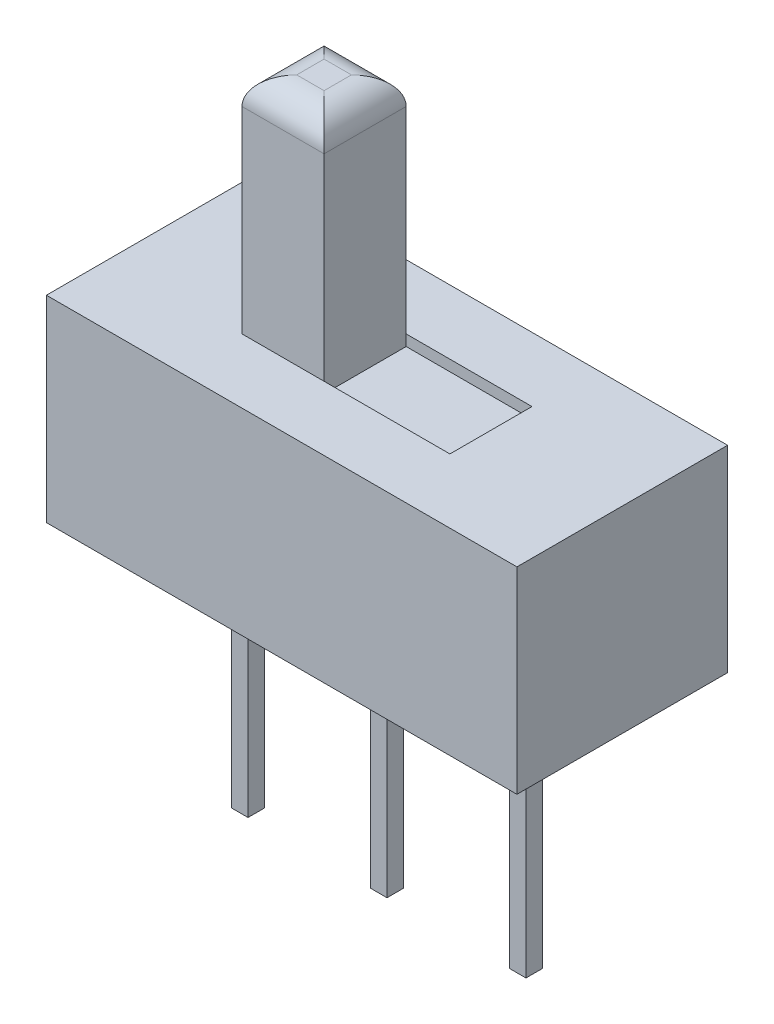
ISO-10303-21;
HEADER;
FILE_DESCRIPTION(('STEP AP214'),'2;1');
FILE_NAME('part.step','',(''),(''),'','','');
FILE_SCHEMA(('AUTOMOTIVE_DESIGN { 1 0 10303 214 1 1 1 1 }'));
ENDSEC;
DATA;
#1=APPLICATION_CONTEXT('core data for automotive mechanical design processes');
#2=APPLICATION_PROTOCOL_DEFINITION('international standard','automotive_design',2000,#1);
#3=PRODUCT_CONTEXT('',#1,'mechanical');
#4=PRODUCT('Part','Part','',(#3));
#5=PRODUCT_RELATED_PRODUCT_CATEGORY('part','',(#4));
#6=PRODUCT_DEFINITION_FORMATION('','',#4);
#7=PRODUCT_DEFINITION_CONTEXT('part definition',#1,'design');
#8=PRODUCT_DEFINITION('design','',#6,#7);
#9=PRODUCT_DEFINITION_SHAPE('','',#8);
#10=(LENGTH_UNIT() NAMED_UNIT(*) SI_UNIT(.MILLI.,.METRE.));
#11=(NAMED_UNIT(*) PLANE_ANGLE_UNIT() SI_UNIT($,.RADIAN.));
#12=(NAMED_UNIT(*) SI_UNIT($,.STERADIAN.) SOLID_ANGLE_UNIT());
#13=UNCERTAINTY_MEASURE_WITH_UNIT(LENGTH_MEASURE(1.E-05),#10,'distance_accuracy_value','');
#14=(GEOMETRIC_REPRESENTATION_CONTEXT(3) GLOBAL_UNCERTAINTY_ASSIGNED_CONTEXT((#13)) GLOBAL_UNIT_ASSIGNED_CONTEXT((#10,
#11,#12)) REPRESENTATION_CONTEXT('',''));
#15=CARTESIAN_POINT('',(0.,0.,0.));
#16=DIRECTION('',(0.,0.,1.));
#17=DIRECTION('',(1.,0.,0.));
#18=AXIS2_PLACEMENT_3D('',#15,#16,#17);
#19=CARTESIAN_POINT('',(0.,0.,0.));
#20=DIRECTION('',(0.,-1.,0.));
#21=DIRECTION('',(0.,0.,-1.));
#22=AXIS2_PLACEMENT_3D('',#19,#20,#21);
#23=PLANE('',#22);
#24=DIRECTION('',(0.,0.,-1.));
#25=VECTOR('',#24,1.);
#26=CARTESIAN_POINT('',(4.3,0.,1.925));
#27=LINE('',#26,#25);
#28=CARTESIAN_POINT('',(4.3,0.,1.925));
#29=VERTEX_POINT('',#28);
#30=CARTESIAN_POINT('',(4.3,0.,-1.925));
#31=VERTEX_POINT('',#30);
#32=EDGE_CURVE('E347',#29,#31,#27,.T.);
#33=ORIENTED_EDGE('',*,*,#32,.F.);
#34=DIRECTION('',(1.,0.,0.));
#35=VECTOR('',#34,1.);
#36=CARTESIAN_POINT('',(-4.3,0.,1.925));
#37=LINE('',#36,#35);
#38=CARTESIAN_POINT('',(-4.3,0.,1.925));
#39=VERTEX_POINT('',#38);
#40=EDGE_CURVE('E352',#39,#29,#37,.T.);
#41=ORIENTED_EDGE('',*,*,#40,.F.);
#42=DIRECTION('',(0.,0.,1.));
#43=VECTOR('',#42,1.);
#44=CARTESIAN_POINT('',(-4.3,0.,1.925));
#45=LINE('',#44,#43);
#46=CARTESIAN_POINT('',(-4.3,0.,-1.925));
#47=VERTEX_POINT('',#46);
#48=EDGE_CURVE('E363',#47,#39,#45,.T.);
#49=ORIENTED_EDGE('',*,*,#48,.F.);
#50=DIRECTION('',(-1.,0.,0.));
#51=VECTOR('',#50,1.);
#52=CARTESIAN_POINT('',(-4.3,0.,-1.925));
#53=LINE('',#52,#51);
#54=EDGE_CURVE('E361',#31,#47,#53,.T.);
#55=ORIENTED_EDGE('',*,*,#54,.F.);
#56=EDGE_LOOP('',(#33,#41,#49,#55));
#57=FACE_BOUND('',#56,.T.);
#58=DIRECTION('',(-1.,0.,0.));
#59=VECTOR('',#58,1.);
#60=CARTESIAN_POINT('',(-0.15,0.,0.15));
#61=LINE('',#60,#59);
#62=CARTESIAN_POINT('',(0.15,0.,0.15));
#63=VERTEX_POINT('',#62);
#64=CARTESIAN_POINT('',(-0.15,0.,0.15));
#65=VERTEX_POINT('',#64);
#66=EDGE_CURVE('E283',#63,#65,#61,.T.);
#67=ORIENTED_EDGE('',*,*,#66,.F.);
#68=DIRECTION('',(0.,0.,1.));
#69=VECTOR('',#68,1.);
#70=CARTESIAN_POINT('',(0.15,0.,-0.15));
#71=LINE('',#70,#69);
#72=CARTESIAN_POINT('',(0.15,0.,-0.15));
#73=VERTEX_POINT('',#72);
#74=EDGE_CURVE('E262',#73,#63,#71,.T.);
#75=ORIENTED_EDGE('',*,*,#74,.F.);
#76=DIRECTION('',(1.,0.,0.));
#77=VECTOR('',#76,1.);
#78=CARTESIAN_POINT('',(-0.15,0.,-0.15));
#79=LINE('',#78,#77);
#80=CARTESIAN_POINT('',(-0.15,0.,-0.15));
#81=VERTEX_POINT('',#80);
#82=EDGE_CURVE('E274',#81,#73,#79,.T.);
#83=ORIENTED_EDGE('',*,*,#82,.F.);
#84=DIRECTION('',(0.,0.,-1.));
#85=VECTOR('',#84,1.);
#86=CARTESIAN_POINT('',(-0.15,0.,-0.15));
#87=LINE('',#86,#85);
#88=EDGE_CURVE('E285',#65,#81,#87,.T.);
#89=ORIENTED_EDGE('',*,*,#88,.F.);
#90=EDGE_LOOP('',(#67,#75,#83,#89));
#91=FACE_BOUND('',#90,.T.);
#92=DIRECTION('',(-1.,0.,0.));
#93=VECTOR('',#92,1.);
#94=CARTESIAN_POINT('',(-2.69,0.,0.15));
#95=LINE('',#94,#93);
#96=CARTESIAN_POINT('',(-2.39,0.,0.15));
#97=VERTEX_POINT('',#96);
#98=CARTESIAN_POINT('',(-2.69,0.,0.15));
#99=VERTEX_POINT('',#98);
#100=EDGE_CURVE('E257',#97,#99,#95,.T.);
#101=ORIENTED_EDGE('',*,*,#100,.F.);
#102=DIRECTION('',(0.,0.,1.));
#103=VECTOR('',#102,1.);
#104=CARTESIAN_POINT('',(-2.39,0.,-0.15));
#105=LINE('',#104,#103);
#106=CARTESIAN_POINT('',(-2.39,0.,-0.15));
#107=VERTEX_POINT('',#106);
#108=EDGE_CURVE('E259',#107,#97,#105,.T.);
#109=ORIENTED_EDGE('',*,*,#108,.F.);
#110=DIRECTION('',(1.,0.,0.));
#111=VECTOR('',#110,1.);
#112=CARTESIAN_POINT('',(-2.69,0.,-0.15));
#113=LINE('',#112,#111);
#114=CARTESIAN_POINT('',(-2.69,0.,-0.15));
#115=VERTEX_POINT('',#114);
#116=EDGE_CURVE('E252',#115,#107,#113,.T.);
#117=ORIENTED_EDGE('',*,*,#116,.F.);
#118=DIRECTION('',(0.,0.,-1.));
#119=VECTOR('',#118,1.);
#120=CARTESIAN_POINT('',(-2.69,0.,-0.15));
#121=LINE('',#120,#119);
#122=EDGE_CURVE('E254',#99,#115,#121,.T.);
#123=ORIENTED_EDGE('',*,*,#122,.F.);
#124=EDGE_LOOP('',(#101,#109,#117,#123));
#125=FACE_BOUND('',#124,.T.);
#126=DIRECTION('',(-1.,0.,0.));
#127=VECTOR('',#126,1.);
#128=CARTESIAN_POINT('',(2.39,0.,0.15));
#129=LINE('',#128,#127);
#130=CARTESIAN_POINT('',(2.69,0.,0.15));
#131=VERTEX_POINT('',#130);
#132=CARTESIAN_POINT('',(2.39,0.,0.15));
#133=VERTEX_POINT('',#132);
#134=EDGE_CURVE('E231',#131,#133,#129,.T.);
#135=ORIENTED_EDGE('',*,*,#134,.F.);
#136=DIRECTION('',(0.,0.,1.));
#137=VECTOR('',#136,1.);
#138=CARTESIAN_POINT('',(2.69,0.,-0.15));
#139=LINE('',#138,#137);
#140=CARTESIAN_POINT('',(2.69,0.,-0.15));
#141=VERTEX_POINT('',#140);
#142=EDGE_CURVE('E226',#141,#131,#139,.T.);
#143=ORIENTED_EDGE('',*,*,#142,.F.);
#144=DIRECTION('',(1.,0.,0.));
#145=VECTOR('',#144,1.);
#146=CARTESIAN_POINT('',(2.39,0.,-0.15));
#147=LINE('',#146,#145);
#148=CARTESIAN_POINT('',(2.39,0.,-0.15));
#149=VERTEX_POINT('',#148);
#150=EDGE_CURVE('E211',#149,#141,#147,.T.);
#151=ORIENTED_EDGE('',*,*,#150,.F.);
#152=DIRECTION('',(0.,0.,-1.));
#153=VECTOR('',#152,1.);
#154=CARTESIAN_POINT('',(2.39,0.,-0.15));
#155=LINE('',#154,#153);
#156=EDGE_CURVE('E219',#133,#149,#155,.T.);
#157=ORIENTED_EDGE('',*,*,#156,.F.);
#158=EDGE_LOOP('',(#135,#143,#151,#157));
#159=FACE_BOUND('',#158,.T.);
#160=ADVANCED_FACE('F42',(#57,#91,#125,#159),#23,.T.);
#161=CARTESIAN_POINT('',(0.,3.6,0.));
#162=DIRECTION('',(0.,-1.,0.));
#163=DIRECTION('',(0.,0.,-1.));
#164=AXIS2_PLACEMENT_3D('',#161,#162,#163);
#165=PLANE('',#164);
#166=DIRECTION('',(0.,0.,-1.));
#167=VECTOR('',#166,1.);
#168=CARTESIAN_POINT('',(4.3,3.6,1.925));
#169=LINE('',#168,#167);
#170=CARTESIAN_POINT('',(4.3,3.6,1.925));
#171=VERTEX_POINT('',#170);
#172=CARTESIAN_POINT('',(4.3,3.6,-1.925));
#173=VERTEX_POINT('',#172);
#174=EDGE_CURVE('E348',#171,#173,#169,.T.);
#175=ORIENTED_EDGE('',*,*,#174,.T.);
#176=DIRECTION('',(-1.,0.,0.));
#177=VECTOR('',#176,1.);
#178=CARTESIAN_POINT('',(-4.3,3.6,-1.925));
#179=LINE('',#178,#177);
#180=CARTESIAN_POINT('',(-4.3,3.6,-1.925));
#181=VERTEX_POINT('',#180);
#182=EDGE_CURVE('E351',#173,#181,#179,.T.);
#183=ORIENTED_EDGE('',*,*,#182,.T.);
#184=DIRECTION('',(0.,0.,1.));
#185=VECTOR('',#184,1.);
#186=CARTESIAN_POINT('',(-4.3,3.6,1.925));
#187=LINE('',#186,#185);
#188=CARTESIAN_POINT('',(-4.3,3.6,1.925));
#189=VERTEX_POINT('',#188);
#190=EDGE_CURVE('E354',#181,#189,#187,.T.);
#191=ORIENTED_EDGE('',*,*,#190,.T.);
#192=DIRECTION('',(1.,0.,0.));
#193=VECTOR('',#192,1.);
#194=CARTESIAN_POINT('',(-4.3,3.6,1.925));
#195=LINE('',#194,#193);
#196=EDGE_CURVE('E356',#189,#171,#195,.T.);
#197=ORIENTED_EDGE('',*,*,#196,.T.);
#198=EDGE_LOOP('',(#175,#183,#191,#197));
#199=FACE_BOUND('',#198,.T.);
#200=DIRECTION('',(0.,0.,-1.));
#201=VECTOR('',#200,1.);
#202=CARTESIAN_POINT('',(1.9,3.6,0.75));
#203=LINE('',#202,#201);
#204=CARTESIAN_POINT('',(1.9,3.6,0.75));
#205=VERTEX_POINT('',#204);
#206=CARTESIAN_POINT('',(1.9,3.6,-0.75));
#207=VERTEX_POINT('',#206);
#208=EDGE_CURVE('E313',#205,#207,#203,.T.);
#209=ORIENTED_EDGE('',*,*,#208,.F.);
#210=DIRECTION('',(1.,0.,0.));
#211=VECTOR('',#210,1.);
#212=CARTESIAN_POINT('',(-0.4,3.6,0.75));
#213=LINE('',#212,#211);
#214=CARTESIAN_POINT('',(-0.4,3.6,0.75));
#215=VERTEX_POINT('',#214);
#216=EDGE_CURVE('E303',#215,#205,#213,.T.);
#217=ORIENTED_EDGE('',*,*,#216,.F.);
#218=DIRECTION('',(1.,0.,0.));
#219=VECTOR('',#218,1.);
#220=CARTESIAN_POINT('',(-1.9,3.6,0.75));
#221=LINE('',#220,#219);
#222=CARTESIAN_POINT('',(-1.9,3.6,0.75));
#223=VERTEX_POINT('',#222);
#224=EDGE_CURVE('E336',#223,#215,#221,.T.);
#225=ORIENTED_EDGE('',*,*,#224,.F.);
#226=DIRECTION('',(0.,0.,1.));
#227=VECTOR('',#226,1.);
#228=CARTESIAN_POINT('',(-1.9,3.6,0.75));
#229=LINE('',#228,#227);
#230=CARTESIAN_POINT('',(-1.9,3.6,-0.75));
#231=VERTEX_POINT('',#230);
#232=EDGE_CURVE('E333',#231,#223,#229,.T.);
#233=ORIENTED_EDGE('',*,*,#232,.F.);
#234=DIRECTION('',(-1.,0.,0.));
#235=VECTOR('',#234,1.);
#236=CARTESIAN_POINT('',(-1.9,3.6,-0.75));
#237=LINE('',#236,#235);
#238=CARTESIAN_POINT('',(-0.4,3.6,-0.75));
#239=VERTEX_POINT('',#238);
#240=EDGE_CURVE('E323',#239,#231,#237,.T.);
#241=ORIENTED_EDGE('',*,*,#240,.F.);
#242=DIRECTION('',(-1.,0.,0.));
#243=VECTOR('',#242,1.);
#244=CARTESIAN_POINT('',(-0.4,3.6,-0.75));
#245=LINE('',#244,#243);
#246=EDGE_CURVE('E316',#207,#239,#245,.T.);
#247=ORIENTED_EDGE('',*,*,#246,.F.);
#248=EDGE_LOOP('',(#209,#217,#225,#233,#241,#247));
#249=FACE_BOUND('',#248,.T.);
#250=ADVANCED_FACE('F425',(#199,#249),#165,.F.);
#251=CARTESIAN_POINT('',(4.3,3.6,1.925));
#252=DIRECTION('',(-1.,0.,0.));
#253=DIRECTION('',(0.,0.,1.));
#254=AXIS2_PLACEMENT_3D('',#251,#252,#253);
#255=PLANE('',#254);
#256=ORIENTED_EDGE('',*,*,#32,.T.);
#257=DIRECTION('',(0.,-1.,0.));
#258=VECTOR('',#257,1.);
#259=CARTESIAN_POINT('',(4.3,3.6,-1.925));
#260=LINE('',#259,#258);
#261=EDGE_CURVE('E374',#173,#31,#260,.T.);
#262=ORIENTED_EDGE('',*,*,#261,.F.);
#263=ORIENTED_EDGE('',*,*,#174,.F.);
#264=DIRECTION('',(0.,-1.,0.));
#265=VECTOR('',#264,1.);
#266=CARTESIAN_POINT('',(4.3,3.6,1.925));
#267=LINE('',#266,#265);
#268=EDGE_CURVE('E358',#171,#29,#267,.T.);
#269=ORIENTED_EDGE('',*,*,#268,.T.);
#270=EDGE_LOOP('',(#256,#262,#263,#269));
#271=FACE_BOUND('',#270,.T.);
#272=ADVANCED_FACE('F458',(#271),#255,.F.);
#273=CARTESIAN_POINT('',(-4.3,3.6,-1.925));
#274=DIRECTION('',(0.,0.,1.));
#275=DIRECTION('',(1.,0.,0.));
#276=AXIS2_PLACEMENT_3D('',#273,#274,#275);
#277=PLANE('',#276);
#278=ORIENTED_EDGE('',*,*,#54,.T.);
#279=DIRECTION('',(0.,-1.,0.));
#280=VECTOR('',#279,1.);
#281=CARTESIAN_POINT('',(-4.3,3.6,-1.925));
#282=LINE('',#281,#280);
#283=EDGE_CURVE('E371',#181,#47,#282,.T.);
#284=ORIENTED_EDGE('',*,*,#283,.F.);
#285=ORIENTED_EDGE('',*,*,#182,.F.);
#286=ORIENTED_EDGE('',*,*,#261,.T.);
#287=EDGE_LOOP('',(#278,#284,#285,#286));
#288=FACE_BOUND('',#287,.T.);
#289=ADVANCED_FACE('F472',(#288),#277,.F.);
#290=CARTESIAN_POINT('',(-4.3,3.6,1.925));
#291=DIRECTION('',(1.,0.,0.));
#292=DIRECTION('',(0.,0.,-1.));
#293=AXIS2_PLACEMENT_3D('',#290,#291,#292);
#294=PLANE('',#293);
#295=ORIENTED_EDGE('',*,*,#48,.T.);
#296=DIRECTION('',(0.,-1.,0.));
#297=VECTOR('',#296,1.);
#298=CARTESIAN_POINT('',(-4.3,3.6,1.925));
#299=LINE('',#298,#297);
#300=EDGE_CURVE('E368',#189,#39,#299,.T.);
#301=ORIENTED_EDGE('',*,*,#300,.F.);
#302=ORIENTED_EDGE('',*,*,#190,.F.);
#303=ORIENTED_EDGE('',*,*,#283,.T.);
#304=EDGE_LOOP('',(#295,#301,#302,#303));
#305=FACE_BOUND('',#304,.T.);
#306=ADVANCED_FACE('F468',(#305),#294,.F.);
#307=CARTESIAN_POINT('',(-4.3,3.6,1.925));
#308=DIRECTION('',(0.,0.,-1.));
#309=DIRECTION('',(-1.,0.,0.));
#310=AXIS2_PLACEMENT_3D('',#307,#308,#309);
#311=PLANE('',#310);
#312=ORIENTED_EDGE('',*,*,#40,.T.);
#313=ORIENTED_EDGE('',*,*,#268,.F.);
#314=ORIENTED_EDGE('',*,*,#196,.F.);
#315=ORIENTED_EDGE('',*,*,#300,.T.);
#316=EDGE_LOOP('',(#312,#313,#314,#315));
#317=FACE_BOUND('',#316,.T.);
#318=ADVANCED_FACE('F465',(#317),#311,.F.);
#319=CARTESIAN_POINT('',(-0.4,7.7,0.75));
#320=DIRECTION('',(-1.,0.,0.));
#321=DIRECTION('',(0.,0.,1.));
#322=AXIS2_PLACEMENT_3D('',#319,#320,#321);
#323=PLANE('',#322);
#324=DIRECTION('',(0.,-1.,0.));
#325=VECTOR('',#324,1.);
#326=CARTESIAN_POINT('',(-0.4,7.7,-0.75));
#327=LINE('',#326,#325);
#328=CARTESIAN_POINT('',(-0.4,7.2,-0.75));
#329=VERTEX_POINT('',#328);
#330=EDGE_CURVE('E345',#329,#239,#327,.T.);
#331=ORIENTED_EDGE('',*,*,#330,.F.);
#332=DIRECTION('',(0.,0.,-1.));
#333=VECTOR('',#332,1.);
#334=CARTESIAN_POINT('',(-0.4,7.2,0.75));
#335=LINE('',#334,#333);
#336=CARTESIAN_POINT('',(-0.4,7.2,0.75));
#337=VERTEX_POINT('',#336);
#338=EDGE_CURVE('E11',#329,#337,#335,.F.);
#339=ORIENTED_EDGE('',*,*,#338,.T.);
#340=DIRECTION('',(0.,-1.,0.));
#341=VECTOR('',#340,1.);
#342=CARTESIAN_POINT('',(-0.4,7.7,0.75));
#343=LINE('',#342,#341);
#344=EDGE_CURVE('E339',#337,#215,#343,.T.);
#345=ORIENTED_EDGE('',*,*,#344,.T.);
#346=DIRECTION('',(0.,1.,0.));
#347=VECTOR('',#346,1.);
#348=CARTESIAN_POINT('',(-0.4,3.4,0.75));
#349=LINE('',#348,#347);
#350=CARTESIAN_POINT('',(-0.4,3.4,0.75));
#351=VERTEX_POINT('',#350);
#352=EDGE_CURVE('E324',#351,#215,#349,.T.);
#353=ORIENTED_EDGE('',*,*,#352,.F.);
#354=DIRECTION('',(0.,0.,1.));
#355=VECTOR('',#354,1.);
#356=CARTESIAN_POINT('',(-0.4,3.4,0.75));
#357=LINE('',#356,#355);
#358=CARTESIAN_POINT('',(-0.4,3.4,-0.75));
#359=VERTEX_POINT('',#358);
#360=EDGE_CURVE('E306',#359,#351,#357,.T.);
#361=ORIENTED_EDGE('',*,*,#360,.F.);
#362=DIRECTION('',(0.,1.,0.));
#363=VECTOR('',#362,1.);
#364=CARTESIAN_POINT('',(-0.4,3.4,-0.75));
#365=LINE('',#364,#363);
#366=EDGE_CURVE('E327',#359,#239,#365,.T.);
#367=ORIENTED_EDGE('',*,*,#366,.T.);
#368=EDGE_LOOP('',(#331,#339,#345,#353,#361,#367));
#369=FACE_BOUND('',#368,.T.);
#370=ADVANCED_FACE('F415',(#369),#323,.F.);
#371=CARTESIAN_POINT('',(-1.9,7.7,-0.75));
#372=DIRECTION('',(0.,0.,1.));
#373=DIRECTION('',(1.,0.,0.));
#374=AXIS2_PLACEMENT_3D('',#371,#372,#373);
#375=PLANE('',#374);
#376=DIRECTION('',(0.,-1.,0.));
#377=VECTOR('',#376,1.);
#378=CARTESIAN_POINT('',(-1.9,7.7,-0.75));
#379=LINE('',#378,#377);
#380=CARTESIAN_POINT('',(-1.9,7.2,-0.75));
#381=VERTEX_POINT('',#380);
#382=EDGE_CURVE('E343',#381,#231,#379,.T.);
#383=ORIENTED_EDGE('',*,*,#382,.F.);
#384=DIRECTION('',(-1.,0.,0.));
#385=VECTOR('',#384,1.);
#386=CARTESIAN_POINT('',(-1.9,7.2,-0.75));
#387=LINE('',#386,#385);
#388=EDGE_CURVE('E51',#381,#329,#387,.F.);
#389=ORIENTED_EDGE('',*,*,#388,.T.);
#390=ORIENTED_EDGE('',*,*,#330,.T.);
#391=ORIENTED_EDGE('',*,*,#240,.T.);
#392=EDGE_LOOP('',(#383,#389,#390,#391));
#393=FACE_BOUND('',#392,.T.);
#394=ADVANCED_FACE('F413',(#393),#375,.F.);
#395=CARTESIAN_POINT('',(-1.9,7.7,0.75));
#396=DIRECTION('',(1.,0.,0.));
#397=DIRECTION('',(0.,0.,-1.));
#398=AXIS2_PLACEMENT_3D('',#395,#396,#397);
#399=PLANE('',#398);
#400=DIRECTION('',(0.,-1.,0.));
#401=VECTOR('',#400,1.);
#402=CARTESIAN_POINT('',(-1.9,7.7,0.75));
#403=LINE('',#402,#401);
#404=CARTESIAN_POINT('',(-1.9,7.2,0.75));
#405=VERTEX_POINT('',#404);
#406=EDGE_CURVE('E341',#405,#223,#403,.T.);
#407=ORIENTED_EDGE('',*,*,#406,.F.);
#408=DIRECTION('',(0.,0.,1.));
#409=VECTOR('',#408,1.);
#410=CARTESIAN_POINT('',(-1.9,7.2,0.75));
#411=LINE('',#410,#409);
#412=EDGE_CURVE('E389',#405,#381,#411,.F.);
#413=ORIENTED_EDGE('',*,*,#412,.T.);
#414=ORIENTED_EDGE('',*,*,#382,.T.);
#415=ORIENTED_EDGE('',*,*,#232,.T.);
#416=EDGE_LOOP('',(#407,#413,#414,#415));
#417=FACE_BOUND('',#416,.T.);
#418=ADVANCED_FACE('F430',(#417),#399,.F.);
#419=CARTESIAN_POINT('',(-1.9,7.7,0.75));
#420=DIRECTION('',(0.,0.,-1.));
#421=DIRECTION('',(-1.,0.,0.));
#422=AXIS2_PLACEMENT_3D('',#419,#420,#421);
#423=PLANE('',#422);
#424=ORIENTED_EDGE('',*,*,#344,.F.);
#425=DIRECTION('',(1.,0.,0.));
#426=VECTOR('',#425,1.);
#427=CARTESIAN_POINT('',(-1.9,7.2,0.75));
#428=LINE('',#427,#426);
#429=EDGE_CURVE('E386',#337,#405,#428,.F.);
#430=ORIENTED_EDGE('',*,*,#429,.T.);
#431=ORIENTED_EDGE('',*,*,#406,.T.);
#432=ORIENTED_EDGE('',*,*,#224,.T.);
#433=EDGE_LOOP('',(#424,#430,#431,#432));
#434=FACE_BOUND('',#433,.T.);
#435=ADVANCED_FACE('F432',(#434),#423,.F.);
#436=CARTESIAN_POINT('',(0.,7.7,0.));
#437=DIRECTION('',(0.,-1.,0.));
#438=DIRECTION('',(0.,0.,-1.));
#439=AXIS2_PLACEMENT_3D('',#436,#437,#438);
#440=PLANE('',#439);
#441=DIRECTION('',(0.,0.,1.));
#442=VECTOR('',#441,1.);
#443=CARTESIAN_POINT('',(-1.4,7.7,0.));
#444=LINE('',#443,#442);
#445=CARTESIAN_POINT('',(-1.4,7.7,-0.25));
#446=VERTEX_POINT('',#445);
#447=CARTESIAN_POINT('',(-1.4,7.7,0.25));
#448=VERTEX_POINT('',#447);
#449=EDGE_CURVE('E381',#446,#448,#444,.T.);
#450=ORIENTED_EDGE('',*,*,#449,.T.);
#451=DIRECTION('',(1.,0.,0.));
#452=VECTOR('',#451,1.);
#453=CARTESIAN_POINT('',(0.,7.7,0.25));
#454=LINE('',#453,#452);
#455=CARTESIAN_POINT('',(-0.9,7.7,0.25));
#456=VERTEX_POINT('',#455);
#457=EDGE_CURVE('E383',#448,#456,#454,.T.);
#458=ORIENTED_EDGE('',*,*,#457,.T.);
#459=DIRECTION('',(0.,0.,-1.));
#460=VECTOR('',#459,1.);
#461=CARTESIAN_POINT('',(-0.9,7.7,0.));
#462=LINE('',#461,#460);
#463=CARTESIAN_POINT('',(-0.9,7.7,-0.25));
#464=VERTEX_POINT('',#463);
#465=EDGE_CURVE('E377',#456,#464,#462,.T.);
#466=ORIENTED_EDGE('',*,*,#465,.T.);
#467=DIRECTION('',(-1.,0.,0.));
#468=VECTOR('',#467,1.);
#469=CARTESIAN_POINT('',(0.,7.7,-0.25));
#470=LINE('',#469,#468);
#471=EDGE_CURVE('E379',#464,#446,#470,.T.);
#472=ORIENTED_EDGE('',*,*,#471,.T.);
#473=EDGE_LOOP('',(#450,#458,#466,#472));
#474=FACE_BOUND('',#473,.T.);
#475=ADVANCED_FACE('F440',(#474),#440,.F.);
#476=CARTESIAN_POINT('',(1.9,3.4,0.75));
#477=DIRECTION('',(1.,0.,0.));
#478=DIRECTION('',(0.,0.,-1.));
#479=AXIS2_PLACEMENT_3D('',#476,#477,#478);
#480=PLANE('',#479);
#481=ORIENTED_EDGE('',*,*,#208,.T.);
#482=DIRECTION('',(0.,1.,0.));
#483=VECTOR('',#482,1.);
#484=CARTESIAN_POINT('',(1.9,3.4,-0.75));
#485=LINE('',#484,#483);
#486=CARTESIAN_POINT('',(1.9,3.4,-0.75));
#487=VERTEX_POINT('',#486);
#488=EDGE_CURVE('E312',#487,#207,#485,.T.);
#489=ORIENTED_EDGE('',*,*,#488,.F.);
#490=DIRECTION('',(0.,0.,-1.));
#491=VECTOR('',#490,1.);
#492=CARTESIAN_POINT('',(1.9,3.4,0.75));
#493=LINE('',#492,#491);
#494=CARTESIAN_POINT('',(1.9,3.4,0.75));
#495=VERTEX_POINT('',#494);
#496=EDGE_CURVE('E299',#495,#487,#493,.T.);
#497=ORIENTED_EDGE('',*,*,#496,.F.);
#498=DIRECTION('',(0.,1.,0.));
#499=VECTOR('',#498,1.);
#500=CARTESIAN_POINT('',(1.9,3.4,0.75));
#501=LINE('',#500,#499);
#502=EDGE_CURVE('E321',#495,#205,#501,.T.);
#503=ORIENTED_EDGE('',*,*,#502,.T.);
#504=EDGE_LOOP('',(#481,#489,#497,#503));
#505=FACE_BOUND('',#504,.T.);
#506=ADVANCED_FACE('F442',(#505),#480,.F.);
#507=CARTESIAN_POINT('',(-0.4,3.4,0.75));
#508=DIRECTION('',(0.,0.,1.));
#509=DIRECTION('',(1.,0.,0.));
#510=AXIS2_PLACEMENT_3D('',#507,#508,#509);
#511=PLANE('',#510);
#512=ORIENTED_EDGE('',*,*,#216,.T.);
#513=ORIENTED_EDGE('',*,*,#502,.F.);
#514=DIRECTION('',(1.,0.,0.));
#515=VECTOR('',#514,1.);
#516=CARTESIAN_POINT('',(-0.4,3.4,0.75));
#517=LINE('',#516,#515);
#518=EDGE_CURVE('E309',#351,#495,#517,.T.);
#519=ORIENTED_EDGE('',*,*,#518,.F.);
#520=ORIENTED_EDGE('',*,*,#352,.T.);
#521=EDGE_LOOP('',(#512,#513,#519,#520));
#522=FACE_BOUND('',#521,.T.);
#523=ADVANCED_FACE('F448',(#522),#511,.F.);
#524=CARTESIAN_POINT('',(-0.4,3.4,-0.75));
#525=DIRECTION('',(0.,0.,-1.));
#526=DIRECTION('',(-1.,0.,0.));
#527=AXIS2_PLACEMENT_3D('',#524,#525,#526);
#528=PLANE('',#527);
#529=ORIENTED_EDGE('',*,*,#246,.T.);
#530=ORIENTED_EDGE('',*,*,#366,.F.);
#531=DIRECTION('',(-1.,0.,0.));
#532=VECTOR('',#531,1.);
#533=CARTESIAN_POINT('',(-0.4,3.4,-0.75));
#534=LINE('',#533,#532);
#535=EDGE_CURVE('E302',#487,#359,#534,.T.);
#536=ORIENTED_EDGE('',*,*,#535,.F.);
#537=ORIENTED_EDGE('',*,*,#488,.T.);
#538=EDGE_LOOP('',(#529,#530,#536,#537));
#539=FACE_BOUND('',#538,.T.);
#540=ADVANCED_FACE('F492',(#539),#528,.F.);
#541=CARTESIAN_POINT('',(0.,3.4,0.));
#542=DIRECTION('',(0.,-1.,0.));
#543=DIRECTION('',(0.,0.,-1.));
#544=AXIS2_PLACEMENT_3D('',#541,#542,#543);
#545=PLANE('',#544);
#546=ORIENTED_EDGE('',*,*,#496,.T.);
#547=ORIENTED_EDGE('',*,*,#535,.T.);
#548=ORIENTED_EDGE('',*,*,#360,.T.);
#549=ORIENTED_EDGE('',*,*,#518,.T.);
#550=EDGE_LOOP('',(#546,#547,#548,#549));
#551=FACE_BOUND('',#550,.T.);
#552=ADVANCED_FACE('F488',(#551),#545,.F.);
#553=CARTESIAN_POINT('',(0.,7.2,-0.25));
#554=DIRECTION('',(-1.,0.,0.));
#555=DIRECTION('',(0.,0.,1.));
#556=AXIS2_PLACEMENT_3D('',#553,#554,#555);
#557=CYLINDRICAL_SURFACE('',#556,0.5);
#558=CARTESIAN_POINT('',(-0.9,7.2,-0.25));
#559=DIRECTION('',(-0.707106781186547,0.,-0.707106781186547));
#560=DIRECTION('',(0.707106781186547,0.,-0.707106781186547));
#561=AXIS2_PLACEMENT_3D('',#558,#559,#560);
#562=ELLIPSE('',#561,0.707106781186547,0.5);
#563=EDGE_CURVE('E394',#329,#464,#562,.F.);
#564=ORIENTED_EDGE('',*,*,#563,.F.);
#565=ORIENTED_EDGE('',*,*,#388,.F.);
#566=CARTESIAN_POINT('',(-1.4,7.2,-0.25));
#567=DIRECTION('',(-0.707106781186547,0.,0.707106781186547));
#568=DIRECTION('',(-0.707106781186547,0.,-0.707106781186547));
#569=AXIS2_PLACEMENT_3D('',#566,#567,#568);
#570=ELLIPSE('',#569,0.707106781186547,0.5);
#571=EDGE_CURVE('E46',#446,#381,#570,.T.);
#572=ORIENTED_EDGE('',*,*,#571,.F.);
#573=ORIENTED_EDGE('',*,*,#471,.F.);
#574=EDGE_LOOP('',(#564,#565,#572,#573));
#575=FACE_BOUND('',#574,.T.);
#576=ADVANCED_FACE('F44',(#575),#557,.T.);
#577=CARTESIAN_POINT('',(-1.4,7.2,0.));
#578=DIRECTION('',(0.,0.,1.));
#579=DIRECTION('',(1.,0.,0.));
#580=AXIS2_PLACEMENT_3D('',#577,#578,#579);
#581=CYLINDRICAL_SURFACE('',#580,0.5);
#582=ORIENTED_EDGE('',*,*,#571,.T.);
#583=ORIENTED_EDGE('',*,*,#412,.F.);
#584=CARTESIAN_POINT('',(-1.4,7.2,0.25));
#585=DIRECTION('',(0.707106781186547,0.,0.707106781186547));
#586=DIRECTION('',(-0.707106781186547,0.,0.707106781186547));
#587=AXIS2_PLACEMENT_3D('',#584,#585,#586);
#588=ELLIPSE('',#587,0.707106781186547,0.5);
#589=EDGE_CURVE('E393',#448,#405,#588,.T.);
#590=ORIENTED_EDGE('',*,*,#589,.F.);
#591=ORIENTED_EDGE('',*,*,#449,.F.);
#592=EDGE_LOOP('',(#582,#583,#590,#591));
#593=FACE_BOUND('',#592,.T.);
#594=ADVANCED_FACE('F405',(#593),#581,.T.);
#595=CARTESIAN_POINT('',(-0.9,7.2,0.));
#596=DIRECTION('',(0.,0.,-1.));
#597=DIRECTION('',(-1.,0.,0.));
#598=AXIS2_PLACEMENT_3D('',#595,#596,#597);
#599=CYLINDRICAL_SURFACE('',#598,0.5);
#600=ORIENTED_EDGE('',*,*,#563,.T.);
#601=ORIENTED_EDGE('',*,*,#465,.F.);
#602=CARTESIAN_POINT('',(-0.9,7.2,0.25));
#603=DIRECTION('',(0.707106781186547,0.,-0.707106781186547));
#604=DIRECTION('',(-0.707106781186547,0.,-0.707106781186547));
#605=AXIS2_PLACEMENT_3D('',#602,#603,#604);
#606=ELLIPSE('',#605,0.707106781186547,0.5);
#607=EDGE_CURVE('E298',#337,#456,#606,.F.);
#608=ORIENTED_EDGE('',*,*,#607,.F.);
#609=ORIENTED_EDGE('',*,*,#338,.F.);
#610=EDGE_LOOP('',(#600,#601,#608,#609));
#611=FACE_BOUND('',#610,.T.);
#612=ADVANCED_FACE('F438',(#611),#599,.T.);
#613=CARTESIAN_POINT('',(0.,7.2,0.25));
#614=DIRECTION('',(1.,0.,0.));
#615=DIRECTION('',(0.,0.,-1.));
#616=AXIS2_PLACEMENT_3D('',#613,#614,#615);
#617=CYLINDRICAL_SURFACE('',#616,0.5);
#618=ORIENTED_EDGE('',*,*,#589,.T.);
#619=ORIENTED_EDGE('',*,*,#429,.F.);
#620=ORIENTED_EDGE('',*,*,#607,.T.);
#621=ORIENTED_EDGE('',*,*,#457,.F.);
#622=EDGE_LOOP('',(#618,#619,#620,#621));
#623=FACE_BOUND('',#622,.T.);
#624=ADVANCED_FACE('F436',(#623),#617,.T.);
#625=CARTESIAN_POINT('',(0.15,-4.6,-0.15));
#626=DIRECTION('',(-1.,0.,0.));
#627=DIRECTION('',(0.,0.,1.));
#628=AXIS2_PLACEMENT_3D('',#625,#626,#627);
#629=PLANE('',#628);
#630=ORIENTED_EDGE('',*,*,#74,.T.);
#631=DIRECTION('',(0.,1.,0.));
#632=VECTOR('',#631,1.);
#633=CARTESIAN_POINT('',(0.15,-4.6,0.15));
#634=LINE('',#633,#632);
#635=CARTESIAN_POINT('',(0.15,-4.6,0.15));
#636=VERTEX_POINT('',#635);
#637=EDGE_CURVE('E296',#636,#63,#634,.T.);
#638=ORIENTED_EDGE('',*,*,#637,.F.);
#639=DIRECTION('',(0.,0.,1.));
#640=VECTOR('',#639,1.);
#641=CARTESIAN_POINT('',(0.15,-4.6,-0.15));
#642=LINE('',#641,#640);
#643=CARTESIAN_POINT('',(0.15,-4.6,-0.15));
#644=VERTEX_POINT('',#643);
#645=EDGE_CURVE('E270',#644,#636,#642,.T.);
#646=ORIENTED_EDGE('',*,*,#645,.F.);
#647=DIRECTION('',(0.,1.,0.));
#648=VECTOR('',#647,1.);
#649=CARTESIAN_POINT('',(0.15,-4.6,-0.15));
#650=LINE('',#649,#648);
#651=EDGE_CURVE('E280',#644,#73,#650,.T.);
#652=ORIENTED_EDGE('',*,*,#651,.T.);
#653=EDGE_LOOP('',(#630,#638,#646,#652));
#654=FACE_BOUND('',#653,.T.);
#655=ADVANCED_FACE('F482',(#654),#629,.F.);
#656=CARTESIAN_POINT('',(-0.15,-4.6,0.15));
#657=DIRECTION('',(0.,0.,-1.));
#658=DIRECTION('',(-1.,0.,0.));
#659=AXIS2_PLACEMENT_3D('',#656,#657,#658);
#660=PLANE('',#659);
#661=ORIENTED_EDGE('',*,*,#66,.T.);
#662=DIRECTION('',(0.,1.,0.));
#663=VECTOR('',#662,1.);
#664=CARTESIAN_POINT('',(-0.15,-4.6,0.15));
#665=LINE('',#664,#663);
#666=CARTESIAN_POINT('',(-0.15,-4.6,0.15));
#667=VERTEX_POINT('',#666);
#668=EDGE_CURVE('E293',#667,#65,#665,.T.);
#669=ORIENTED_EDGE('',*,*,#668,.F.);
#670=DIRECTION('',(-1.,0.,0.));
#671=VECTOR('',#670,1.);
#672=CARTESIAN_POINT('',(-0.15,-4.6,0.15));
#673=LINE('',#672,#671);
#674=EDGE_CURVE('E273',#636,#667,#673,.T.);
#675=ORIENTED_EDGE('',*,*,#674,.F.);
#676=ORIENTED_EDGE('',*,*,#637,.T.);
#677=EDGE_LOOP('',(#661,#669,#675,#676));
#678=FACE_BOUND('',#677,.T.);
#679=ADVANCED_FACE('F550',(#678),#660,.F.);
#680=CARTESIAN_POINT('',(-0.15,-4.6,-0.15));
#681=DIRECTION('',(1.,0.,0.));
#682=DIRECTION('',(0.,0.,-1.));
#683=AXIS2_PLACEMENT_3D('',#680,#681,#682);
#684=PLANE('',#683);
#685=ORIENTED_EDGE('',*,*,#88,.T.);
#686=DIRECTION('',(0.,1.,0.));
#687=VECTOR('',#686,1.);
#688=CARTESIAN_POINT('',(-0.15,-4.6,-0.15));
#689=LINE('',#688,#687);
#690=CARTESIAN_POINT('',(-0.15,-4.6,-0.15));
#691=VERTEX_POINT('',#690);
#692=EDGE_CURVE('E291',#691,#81,#689,.T.);
#693=ORIENTED_EDGE('',*,*,#692,.F.);
#694=DIRECTION('',(0.,0.,-1.));
#695=VECTOR('',#694,1.);
#696=CARTESIAN_POINT('',(-0.15,-4.6,-0.15));
#697=LINE('',#696,#695);
#698=EDGE_CURVE('E276',#667,#691,#697,.T.);
#699=ORIENTED_EDGE('',*,*,#698,.F.);
#700=ORIENTED_EDGE('',*,*,#668,.T.);
#701=EDGE_LOOP('',(#685,#693,#699,#700));
#702=FACE_BOUND('',#701,.T.);
#703=ADVANCED_FACE('F559',(#702),#684,.F.);
#704=CARTESIAN_POINT('',(-0.15,-4.6,-0.15));
#705=DIRECTION('',(0.,0.,1.));
#706=DIRECTION('',(1.,0.,0.));
#707=AXIS2_PLACEMENT_3D('',#704,#705,#706);
#708=PLANE('',#707);
#709=ORIENTED_EDGE('',*,*,#82,.T.);
#710=ORIENTED_EDGE('',*,*,#651,.F.);
#711=DIRECTION('',(1.,0.,0.));
#712=VECTOR('',#711,1.);
#713=CARTESIAN_POINT('',(-0.15,-4.6,-0.15));
#714=LINE('',#713,#712);
#715=EDGE_CURVE('E278',#691,#644,#714,.T.);
#716=ORIENTED_EDGE('',*,*,#715,.F.);
#717=ORIENTED_EDGE('',*,*,#692,.T.);
#718=EDGE_LOOP('',(#709,#710,#716,#717));
#719=FACE_BOUND('',#718,.T.);
#720=ADVANCED_FACE('F568',(#719),#708,.F.);
#721=CARTESIAN_POINT('',(0.,-4.6,0.));
#722=DIRECTION('',(0.,1.,0.));
#723=DIRECTION('',(0.,0.,1.));
#724=AXIS2_PLACEMENT_3D('',#721,#722,#723);
#725=PLANE('',#724);
#726=ORIENTED_EDGE('',*,*,#645,.T.);
#727=ORIENTED_EDGE('',*,*,#674,.T.);
#728=ORIENTED_EDGE('',*,*,#698,.T.);
#729=ORIENTED_EDGE('',*,*,#715,.T.);
#730=EDGE_LOOP('',(#726,#727,#728,#729));
#731=FACE_BOUND('',#730,.T.);
#732=ADVANCED_FACE('F578',(#731),#725,.F.);
#733=CARTESIAN_POINT('',(-2.39,-4.6,-0.15));
#734=DIRECTION('',(-1.,0.,0.));
#735=DIRECTION('',(0.,0.,1.));
#736=AXIS2_PLACEMENT_3D('',#733,#734,#735);
#737=PLANE('',#736);
#738=ORIENTED_EDGE('',*,*,#108,.T.);
#739=DIRECTION('',(0.,1.,0.));
#740=VECTOR('',#739,1.);
#741=CARTESIAN_POINT('',(-2.39,-4.6,0.15));
#742=LINE('',#741,#740);
#743=CARTESIAN_POINT('',(-2.39,-4.6,0.15));
#744=VERTEX_POINT('',#743);
#745=EDGE_CURVE('E232',#744,#97,#742,.T.);
#746=ORIENTED_EDGE('',*,*,#745,.F.);
#747=DIRECTION('',(0.,0.,1.));
#748=VECTOR('',#747,1.);
#749=CARTESIAN_POINT('',(-2.39,-4.6,-0.15));
#750=LINE('',#749,#748);
#751=CARTESIAN_POINT('',(-2.39,-4.6,-0.15));
#752=VERTEX_POINT('',#751);
#753=EDGE_CURVE('E255',#752,#744,#750,.T.);
#754=ORIENTED_EDGE('',*,*,#753,.F.);
#755=DIRECTION('',(0.,1.,0.));
#756=VECTOR('',#755,1.);
#757=CARTESIAN_POINT('',(-2.39,-4.6,-0.15));
#758=LINE('',#757,#756);
#759=EDGE_CURVE('E248',#752,#107,#758,.T.);
#760=ORIENTED_EDGE('',*,*,#759,.T.);
#761=EDGE_LOOP('',(#738,#746,#754,#760));
#762=FACE_BOUND('',#761,.T.);
#763=ADVANCED_FACE('F588',(#762),#737,.F.);
#764=CARTESIAN_POINT('',(-2.69,-4.6,0.15));
#765=DIRECTION('',(0.,0.,-1.));
#766=DIRECTION('',(-1.,0.,0.));
#767=AXIS2_PLACEMENT_3D('',#764,#765,#766);
#768=PLANE('',#767);
#769=ORIENTED_EDGE('',*,*,#100,.T.);
#770=DIRECTION('',(0.,1.,0.));
#771=VECTOR('',#770,1.);
#772=CARTESIAN_POINT('',(-2.69,-4.6,0.15));
#773=LINE('',#772,#771);
#774=CARTESIAN_POINT('',(-2.69,-4.6,0.15));
#775=VERTEX_POINT('',#774);
#776=EDGE_CURVE('E234',#775,#99,#773,.T.);
#777=ORIENTED_EDGE('',*,*,#776,.F.);
#778=DIRECTION('',(-1.,0.,0.));
#779=VECTOR('',#778,1.);
#780=CARTESIAN_POINT('',(-2.69,-4.6,0.15));
#781=LINE('',#780,#779);
#782=EDGE_CURVE('E266',#744,#775,#781,.T.);
#783=ORIENTED_EDGE('',*,*,#782,.F.);
#784=ORIENTED_EDGE('',*,*,#745,.T.);
#785=EDGE_LOOP('',(#769,#777,#783,#784));
#786=FACE_BOUND('',#785,.T.);
#787=ADVANCED_FACE('F598',(#786),#768,.F.);
#788=CARTESIAN_POINT('',(-2.69,-4.6,-0.15));
#789=DIRECTION('',(1.,0.,0.));
#790=DIRECTION('',(0.,0.,-1.));
#791=AXIS2_PLACEMENT_3D('',#788,#789,#790);
#792=PLANE('',#791);
#793=ORIENTED_EDGE('',*,*,#122,.T.);
#794=DIRECTION('',(0.,1.,0.));
#795=VECTOR('',#794,1.);
#796=CARTESIAN_POINT('',(-2.69,-4.6,-0.15));
#797=LINE('',#796,#795);
#798=CARTESIAN_POINT('',(-2.69,-4.6,-0.15));
#799=VERTEX_POINT('',#798);
#800=EDGE_CURVE('E67',#799,#115,#797,.T.);
#801=ORIENTED_EDGE('',*,*,#800,.F.);
#802=DIRECTION('',(0.,0.,-1.));
#803=VECTOR('',#802,1.);
#804=CARTESIAN_POINT('',(-2.69,-4.6,-0.15));
#805=LINE('',#804,#803);
#806=EDGE_CURVE('E264',#775,#799,#805,.T.);
#807=ORIENTED_EDGE('',*,*,#806,.F.);
#808=ORIENTED_EDGE('',*,*,#776,.T.);
#809=EDGE_LOOP('',(#793,#801,#807,#808));
#810=FACE_BOUND('',#809,.T.);
#811=ADVANCED_FACE('F608',(#810),#792,.F.);
#812=CARTESIAN_POINT('',(-2.69,-4.6,-0.15));
#813=DIRECTION('',(0.,0.,1.));
#814=DIRECTION('',(1.,0.,0.));
#815=AXIS2_PLACEMENT_3D('',#812,#813,#814);
#816=PLANE('',#815);
#817=ORIENTED_EDGE('',*,*,#116,.T.);
#818=ORIENTED_EDGE('',*,*,#759,.F.);
#819=DIRECTION('',(1.,0.,0.));
#820=VECTOR('',#819,1.);
#821=CARTESIAN_POINT('',(-2.69,-4.6,-0.15));
#822=LINE('',#821,#820);
#823=EDGE_CURVE('E251',#799,#752,#822,.T.);
#824=ORIENTED_EDGE('',*,*,#823,.F.);
#825=ORIENTED_EDGE('',*,*,#800,.T.);
#826=EDGE_LOOP('',(#817,#818,#824,#825));
#827=FACE_BOUND('',#826,.T.);
#828=ADVANCED_FACE('F618',(#827),#816,.F.);
#829=CARTESIAN_POINT('',(0.,-4.6,0.));
#830=DIRECTION('',(0.,1.,0.));
#831=DIRECTION('',(0.,0.,1.));
#832=AXIS2_PLACEMENT_3D('',#829,#830,#831);
#833=PLANE('',#832);
#834=ORIENTED_EDGE('',*,*,#753,.T.);
#835=ORIENTED_EDGE('',*,*,#782,.T.);
#836=ORIENTED_EDGE('',*,*,#806,.T.);
#837=ORIENTED_EDGE('',*,*,#823,.T.);
#838=EDGE_LOOP('',(#834,#835,#836,#837));
#839=FACE_BOUND('',#838,.T.);
#840=ADVANCED_FACE('F628',(#839),#833,.F.);
#841=CARTESIAN_POINT('',(2.69,-4.6,-0.15));
#842=DIRECTION('',(-1.,0.,0.));
#843=DIRECTION('',(0.,0.,1.));
#844=AXIS2_PLACEMENT_3D('',#841,#842,#843);
#845=PLANE('',#844);
#846=ORIENTED_EDGE('',*,*,#142,.T.);
#847=DIRECTION('',(0.,1.,0.));
#848=VECTOR('',#847,1.);
#849=CARTESIAN_POINT('',(2.69,-4.6,0.15));
#850=LINE('',#849,#848);
#851=CARTESIAN_POINT('',(2.69,-4.6,0.15));
#852=VERTEX_POINT('',#851);
#853=EDGE_CURVE('E897',#852,#131,#850,.T.);
#854=ORIENTED_EDGE('',*,*,#853,.F.);
#855=DIRECTION('',(0.,0.,1.));
#856=VECTOR('',#855,1.);
#857=CARTESIAN_POINT('',(2.69,-4.6,-0.15));
#858=LINE('',#857,#856);
#859=CARTESIAN_POINT('',(2.69,-4.6,-0.15));
#860=VERTEX_POINT('',#859);
#861=EDGE_CURVE('E220',#860,#852,#858,.T.);
#862=ORIENTED_EDGE('',*,*,#861,.F.);
#863=DIRECTION('',(0.,1.,0.));
#864=VECTOR('',#863,1.);
#865=CARTESIAN_POINT('',(2.69,-4.6,-0.15));
#866=LINE('',#865,#864);
#867=EDGE_CURVE('E214',#860,#141,#866,.T.);
#868=ORIENTED_EDGE('',*,*,#867,.T.);
#869=EDGE_LOOP('',(#846,#854,#862,#868));
#870=FACE_BOUND('',#869,.T.);
#871=ADVANCED_FACE('F224',(#870),#845,.F.);
#872=CARTESIAN_POINT('',(2.39,-4.6,0.15));
#873=DIRECTION('',(0.,0.,-1.));
#874=DIRECTION('',(-1.,0.,0.));
#875=AXIS2_PLACEMENT_3D('',#872,#873,#874);
#876=PLANE('',#875);
#877=ORIENTED_EDGE('',*,*,#134,.T.);
#878=DIRECTION('',(0.,1.,0.));
#879=VECTOR('',#878,1.);
#880=CARTESIAN_POINT('',(2.39,-4.6,0.15));
#881=LINE('',#880,#879);
#882=CARTESIAN_POINT('',(2.39,-4.6,0.15));
#883=VERTEX_POINT('',#882);
#884=EDGE_CURVE('E898',#883,#133,#881,.T.);
#885=ORIENTED_EDGE('',*,*,#884,.F.);
#886=DIRECTION('',(-1.,0.,0.));
#887=VECTOR('',#886,1.);
#888=CARTESIAN_POINT('',(2.39,-4.6,0.15));
#889=LINE('',#888,#887);
#890=EDGE_CURVE('E242',#852,#883,#889,.T.);
#891=ORIENTED_EDGE('',*,*,#890,.F.);
#892=ORIENTED_EDGE('',*,*,#853,.T.);
#893=EDGE_LOOP('',(#877,#885,#891,#892));
#894=FACE_BOUND('',#893,.T.);
#895=ADVANCED_FACE('F646',(#894),#876,.F.);
#896=CARTESIAN_POINT('',(2.39,-4.6,-0.15));
#897=DIRECTION('',(1.,0.,0.));
#898=DIRECTION('',(0.,0.,-1.));
#899=AXIS2_PLACEMENT_3D('',#896,#897,#898);
#900=PLANE('',#899);
#901=ORIENTED_EDGE('',*,*,#156,.T.);
#902=DIRECTION('',(0.,1.,0.));
#903=VECTOR('',#902,1.);
#904=CARTESIAN_POINT('',(2.39,-4.6,-0.15));
#905=LINE('',#904,#903);
#906=CARTESIAN_POINT('',(2.39,-4.6,-0.15));
#907=VERTEX_POINT('',#906);
#908=EDGE_CURVE('E59',#907,#149,#905,.T.);
#909=ORIENTED_EDGE('',*,*,#908,.F.);
#910=DIRECTION('',(0.,0.,-1.));
#911=VECTOR('',#910,1.);
#912=CARTESIAN_POINT('',(2.39,-4.6,-0.15));
#913=LINE('',#912,#911);
#914=EDGE_CURVE('E240',#883,#907,#913,.T.);
#915=ORIENTED_EDGE('',*,*,#914,.F.);
#916=ORIENTED_EDGE('',*,*,#884,.T.);
#917=EDGE_LOOP('',(#901,#909,#915,#916));
#918=FACE_BOUND('',#917,.T.);
#919=ADVANCED_FACE('F655',(#918),#900,.F.);
#920=CARTESIAN_POINT('',(2.39,-4.6,-0.15));
#921=DIRECTION('',(0.,0.,1.));
#922=DIRECTION('',(1.,0.,0.));
#923=AXIS2_PLACEMENT_3D('',#920,#921,#922);
#924=PLANE('',#923);
#925=ORIENTED_EDGE('',*,*,#150,.T.);
#926=ORIENTED_EDGE('',*,*,#867,.F.);
#927=DIRECTION('',(1.,0.,0.));
#928=VECTOR('',#927,1.);
#929=CARTESIAN_POINT('',(2.39,-4.6,-0.15));
#930=LINE('',#929,#928);
#931=EDGE_CURVE('E229',#907,#860,#930,.T.);
#932=ORIENTED_EDGE('',*,*,#931,.F.);
#933=ORIENTED_EDGE('',*,*,#908,.T.);
#934=EDGE_LOOP('',(#925,#926,#932,#933));
#935=FACE_BOUND('',#934,.T.);
#936=ADVANCED_FACE('F213',(#935),#924,.F.);
#937=CARTESIAN_POINT('',(0.,-4.6,0.));
#938=DIRECTION('',(0.,1.,0.));
#939=DIRECTION('',(0.,0.,1.));
#940=AXIS2_PLACEMENT_3D('',#937,#938,#939);
#941=PLANE('',#940);
#942=ORIENTED_EDGE('',*,*,#861,.T.);
#943=ORIENTED_EDGE('',*,*,#890,.T.);
#944=ORIENTED_EDGE('',*,*,#914,.T.);
#945=ORIENTED_EDGE('',*,*,#931,.T.);
#946=EDGE_LOOP('',(#942,#943,#944,#945));
#947=FACE_BOUND('',#946,.T.);
#948=ADVANCED_FACE('F674',(#947),#941,.F.);
#949=CLOSED_SHELL('',(#160,#250,#272,#289,#306,#318,#370,#394,#418,#435,#475,#506,#523,#540,
#552,#576,#594,#612,#624,#655,#679,#703,#720,#732,#763,#787,#811,#828,#840,#871,#895,#919,#936,#948));
#950=MANIFOLD_SOLID_BREP('B2',#949);
#951=ADVANCED_BREP_SHAPE_REPRESENTATION('',(#18,#950),#14);
#952=SHAPE_DEFINITION_REPRESENTATION(#9,#951);
ENDSEC;
END-ISO-10303-21;
